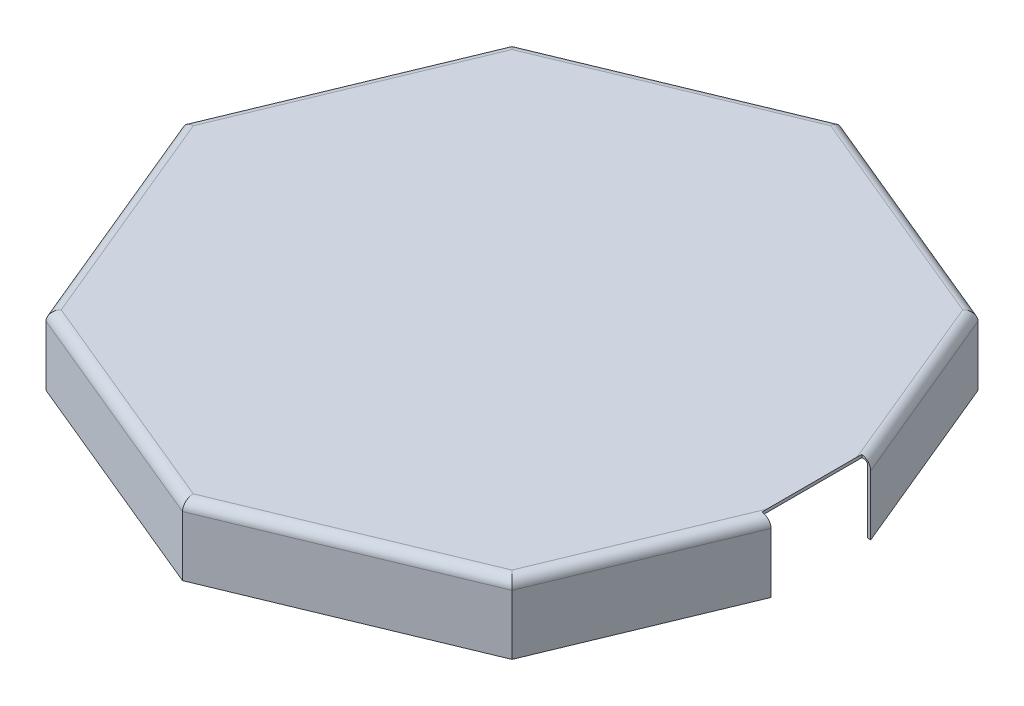
ISO-10303-21;
HEADER;
FILE_DESCRIPTION(('STEP AP214'),'2;1');
FILE_NAME('part.step','',(''),(''),'','','');
FILE_SCHEMA(('AUTOMOTIVE_DESIGN { 1 0 10303 214 1 1 1 1 }'));
ENDSEC;
DATA;
#1=APPLICATION_CONTEXT('core data for automotive mechanical design processes');
#2=APPLICATION_PROTOCOL_DEFINITION('international standard','automotive_design',2000,#1);
#3=PRODUCT_CONTEXT('',#1,'mechanical');
#4=PRODUCT('Part','Part','',(#3));
#5=PRODUCT_RELATED_PRODUCT_CATEGORY('part','',(#4));
#6=PRODUCT_DEFINITION_FORMATION('','',#4);
#7=PRODUCT_DEFINITION_CONTEXT('part definition',#1,'design');
#8=PRODUCT_DEFINITION('design','',#6,#7);
#9=PRODUCT_DEFINITION_SHAPE('','',#8);
#10=(LENGTH_UNIT() NAMED_UNIT(*) SI_UNIT(.MILLI.,.METRE.));
#11=(NAMED_UNIT(*) PLANE_ANGLE_UNIT() SI_UNIT($,.RADIAN.));
#12=(NAMED_UNIT(*) SI_UNIT($,.STERADIAN.) SOLID_ANGLE_UNIT());
#13=UNCERTAINTY_MEASURE_WITH_UNIT(LENGTH_MEASURE(1.E-05),#10,'distance_accuracy_value','');
#14=(GEOMETRIC_REPRESENTATION_CONTEXT(3) GLOBAL_UNCERTAINTY_ASSIGNED_CONTEXT((#13)) GLOBAL_UNIT_ASSIGNED_CONTEXT((#10,
#11,#12)) REPRESENTATION_CONTEXT('',''));
#15=CARTESIAN_POINT('',(0.,0.,0.));
#16=DIRECTION('',(0.,0.,1.));
#17=DIRECTION('',(1.,0.,0.));
#18=AXIS2_PLACEMENT_3D('',#15,#16,#17);
#19=CARTESIAN_POINT('',(0.,70.,330.560430113723));
#20=DIRECTION('',(-0.38268343236509,0.,-0.923879532511287));
#21=DIRECTION('',(-0.923879532511287,0.,0.38268343236509));
#22=AXIS2_PLACEMENT_3D('',#19,#20,#21);
#23=PLANE('',#22);
#24=DIRECTION('',(0.,-1.,0.));
#25=VECTOR('',#24,1.);
#26=CARTESIAN_POINT('',(233.741521725355,70.,233.741521725356));
#27=LINE('',#26,#25);
#28=CARTESIAN_POINT('',(233.741521725355,60.,233.741521725356));
#29=VERTEX_POINT('',#28);
#30=CARTESIAN_POINT('',(233.741521725355,0.,233.741521725356));
#31=VERTEX_POINT('',#30);
#32=EDGE_CURVE('E251',#29,#31,#27,.T.);
#33=ORIENTED_EDGE('',*,*,#32,.F.);
#34=DIRECTION('',(0.923879532511287,0.,-0.38268343236509));
#35=VECTOR('',#34,1.);
#36=CARTESIAN_POINT('',(0.,60.,330.560430113723));
#37=LINE('',#36,#35);
#38=CARTESIAN_POINT('',(0.,60.,330.560430113723));
#39=VERTEX_POINT('',#38);
#40=EDGE_CURVE('E380',#29,#39,#37,.F.);
#41=ORIENTED_EDGE('',*,*,#40,.T.);
#42=DIRECTION('',(0.,-1.,0.));
#43=VECTOR('',#42,1.);
#44=CARTESIAN_POINT('',(0.,70.,330.560430113723));
#45=LINE('',#44,#43);
#46=CARTESIAN_POINT('',(0.,0.,330.560430113723));
#47=VERTEX_POINT('',#46);
#48=EDGE_CURVE('E341',#39,#47,#45,.T.);
#49=ORIENTED_EDGE('',*,*,#48,.T.);
#50=DIRECTION('',(0.923879532511287,0.,-0.38268343236509));
#51=VECTOR('',#50,1.);
#52=CARTESIAN_POINT('',(0.,0.,330.560430113723));
#53=LINE('',#52,#51);
#54=EDGE_CURVE('E282',#47,#31,#53,.T.);
#55=ORIENTED_EDGE('',*,*,#54,.T.);
#56=EDGE_LOOP('',(#33,#41,#49,#55));
#57=FACE_BOUND('',#56,.T.);
#58=ADVANCED_FACE('F37',(#57),#23,.F.);
#59=CARTESIAN_POINT('',(233.741521725355,70.,233.741521725356));
#60=DIRECTION('',(-0.923879532511287,0.,-0.38268343236509));
#61=DIRECTION('',(-0.38268343236509,0.,0.923879532511287));
#62=AXIS2_PLACEMENT_3D('',#59,#60,#61);
#63=PLANE('',#62);
#64=DIRECTION('',(0.,1.,0.));
#65=VECTOR('',#64,1.);
#66=CARTESIAN_POINT('',(309.849751995068,70.,49.9999999999999));
#67=LINE('',#66,#65);
#68=CARTESIAN_POINT('',(309.849751995068,0.,50.));
#69=VERTEX_POINT('',#68);
#70=CARTESIAN_POINT('',(309.849751995068,60.,49.9999999999999));
#71=VERTEX_POINT('',#70);
#72=EDGE_CURVE('E276',#69,#71,#67,.T.);
#73=ORIENTED_EDGE('',*,*,#72,.T.);
#74=DIRECTION('',(0.38268343236509,0.,-0.923879532511287));
#75=VECTOR('',#74,1.);
#76=CARTESIAN_POINT('',(233.741521725355,60.,233.741521725356));
#77=LINE('',#76,#75);
#78=EDGE_CURVE('E378',#71,#29,#77,.F.);
#79=ORIENTED_EDGE('',*,*,#78,.T.);
#80=ORIENTED_EDGE('',*,*,#32,.T.);
#81=DIRECTION('',(0.38268343236509,0.,-0.923879532511287));
#82=VECTOR('',#81,1.);
#83=CARTESIAN_POINT('',(233.741521725355,0.,233.741521725356));
#84=LINE('',#83,#82);
#85=EDGE_CURVE('E320',#31,#69,#84,.T.);
#86=ORIENTED_EDGE('',*,*,#85,.T.);
#87=EDGE_LOOP('',(#73,#79,#80,#86));
#88=FACE_BOUND('',#87,.T.);
#89=ADVANCED_FACE('F487',(#88),#63,.F.);
#90=CARTESIAN_POINT('',(330.560430113723,70.,0.));
#91=DIRECTION('',(-0.923879532511287,0.,0.38268343236509));
#92=DIRECTION('',(0.38268343236509,0.,0.923879532511287));
#93=AXIS2_PLACEMENT_3D('',#90,#91,#92);
#94=PLANE('',#93);
#95=DIRECTION('',(0.,-1.,0.));
#96=VECTOR('',#95,1.);
#97=CARTESIAN_POINT('',(233.741521725355,70.,-233.741521725356));
#98=LINE('',#97,#96);
#99=CARTESIAN_POINT('',(233.741521725355,60.,-233.741521725356));
#100=VERTEX_POINT('',#99);
#101=CARTESIAN_POINT('',(233.741521725355,0.,-233.741521725356));
#102=VERTEX_POINT('',#101);
#103=EDGE_CURVE('E351',#100,#102,#98,.T.);
#104=ORIENTED_EDGE('',*,*,#103,.F.);
#105=DIRECTION('',(-0.38268343236509,0.,-0.923879532511287));
#106=VECTOR('',#105,1.);
#107=CARTESIAN_POINT('',(309.849751995068,60.,-50.));
#108=LINE('',#107,#106);
#109=CARTESIAN_POINT('',(309.849751995068,60.,-50.));
#110=VERTEX_POINT('',#109);
#111=EDGE_CURVE('E392',#100,#110,#108,.F.);
#112=ORIENTED_EDGE('',*,*,#111,.T.);
#113=DIRECTION('',(0.,-1.,0.));
#114=VECTOR('',#113,1.);
#115=CARTESIAN_POINT('',(309.849751995068,70.,-50.));
#116=LINE('',#115,#114);
#117=CARTESIAN_POINT('',(309.849751995068,0.,-50.));
#118=VERTEX_POINT('',#117);
#119=EDGE_CURVE('E271',#110,#118,#116,.T.);
#120=ORIENTED_EDGE('',*,*,#119,.T.);
#121=DIRECTION('',(-0.38268343236509,0.,-0.923879532511287));
#122=VECTOR('',#121,1.);
#123=CARTESIAN_POINT('',(330.560430113723,0.,0.));
#124=LINE('',#123,#122);
#125=EDGE_CURVE('E323',#118,#102,#124,.T.);
#126=ORIENTED_EDGE('',*,*,#125,.T.);
#127=EDGE_LOOP('',(#104,#112,#120,#126));
#128=FACE_BOUND('',#127,.T.);
#129=ADVANCED_FACE('F558',(#128),#94,.F.);
#130=CARTESIAN_POINT('',(233.741521725355,70.,-233.741521725356));
#131=DIRECTION('',(-0.38268343236509,0.,0.923879532511287));
#132=DIRECTION('',(0.923879532511287,0.,0.38268343236509));
#133=AXIS2_PLACEMENT_3D('',#130,#131,#132);
#134=PLANE('',#133);
#135=DIRECTION('',(0.,-1.,0.));
#136=VECTOR('',#135,1.);
#137=CARTESIAN_POINT('',(0.,70.,-330.560430113723));
#138=LINE('',#137,#136);
#139=CARTESIAN_POINT('',(0.,60.,-330.560430113723));
#140=VERTEX_POINT('',#139);
#141=CARTESIAN_POINT('',(0.,0.,-330.560430113723));
#142=VERTEX_POINT('',#141);
#143=EDGE_CURVE('E349',#140,#142,#138,.T.);
#144=ORIENTED_EDGE('',*,*,#143,.F.);
#145=DIRECTION('',(-0.923879532511287,0.,-0.38268343236509));
#146=VECTOR('',#145,1.);
#147=CARTESIAN_POINT('',(233.741521725355,60.,-233.741521725356));
#148=LINE('',#147,#146);
#149=EDGE_CURVE('E390',#140,#100,#148,.F.);
#150=ORIENTED_EDGE('',*,*,#149,.T.);
#151=ORIENTED_EDGE('',*,*,#103,.T.);
#152=DIRECTION('',(-0.923879532511287,0.,-0.38268343236509));
#153=VECTOR('',#152,1.);
#154=CARTESIAN_POINT('',(233.741521725355,0.,-233.741521725356));
#155=LINE('',#154,#153);
#156=EDGE_CURVE('E326',#102,#142,#155,.T.);
#157=ORIENTED_EDGE('',*,*,#156,.T.);
#158=EDGE_LOOP('',(#144,#150,#151,#157));
#159=FACE_BOUND('',#158,.T.);
#160=ADVANCED_FACE('F552',(#159),#134,.F.);
#161=CARTESIAN_POINT('',(0.,70.,-330.560430113723));
#162=DIRECTION('',(0.38268343236509,0.,0.923879532511287));
#163=DIRECTION('',(0.923879532511287,0.,-0.38268343236509));
#164=AXIS2_PLACEMENT_3D('',#161,#162,#163);
#165=PLANE('',#164);
#166=DIRECTION('',(0.,-1.,0.));
#167=VECTOR('',#166,1.);
#168=CARTESIAN_POINT('',(-233.741521725356,70.,-233.741521725356));
#169=LINE('',#168,#167);
#170=CARTESIAN_POINT('',(-233.741521725356,60.,-233.741521725356));
#171=VERTEX_POINT('',#170);
#172=CARTESIAN_POINT('',(-233.741521725356,0.,-233.741521725356));
#173=VERTEX_POINT('',#172);
#174=EDGE_CURVE('E347',#171,#173,#169,.T.);
#175=ORIENTED_EDGE('',*,*,#174,.F.);
#176=DIRECTION('',(-0.923879532511287,0.,0.38268343236509));
#177=VECTOR('',#176,1.);
#178=CARTESIAN_POINT('',(0.,60.,-330.560430113723));
#179=LINE('',#178,#177);
#180=EDGE_CURVE('E388',#171,#140,#179,.F.);
#181=ORIENTED_EDGE('',*,*,#180,.T.);
#182=ORIENTED_EDGE('',*,*,#143,.T.);
#183=DIRECTION('',(-0.923879532511287,0.,0.38268343236509));
#184=VECTOR('',#183,1.);
#185=CARTESIAN_POINT('',(0.,0.,-330.560430113723));
#186=LINE('',#185,#184);
#187=EDGE_CURVE('E329',#142,#173,#186,.T.);
#188=ORIENTED_EDGE('',*,*,#187,.T.);
#189=EDGE_LOOP('',(#175,#181,#182,#188));
#190=FACE_BOUND('',#189,.T.);
#191=ADVANCED_FACE('F549',(#190),#165,.F.);
#192=CARTESIAN_POINT('',(-233.741521725356,70.,-233.741521725356));
#193=DIRECTION('',(0.923879532511287,0.,0.382683432365089));
#194=DIRECTION('',(0.38268343236509,0.,-0.923879532511287));
#195=AXIS2_PLACEMENT_3D('',#192,#193,#194);
#196=PLANE('',#195);
#197=DIRECTION('',(0.,-1.,0.));
#198=VECTOR('',#197,1.);
#199=CARTESIAN_POINT('',(-330.560430113723,70.,0.));
#200=LINE('',#199,#198);
#201=CARTESIAN_POINT('',(-330.560430113723,60.,0.));
#202=VERTEX_POINT('',#201);
#203=CARTESIAN_POINT('',(-330.560430113723,0.,0.));
#204=VERTEX_POINT('',#203);
#205=EDGE_CURVE('E345',#202,#204,#200,.T.);
#206=ORIENTED_EDGE('',*,*,#205,.F.);
#207=DIRECTION('',(-0.38268343236509,0.,0.923879532511287));
#208=VECTOR('',#207,1.);
#209=CARTESIAN_POINT('',(-233.741521725356,60.,-233.741521725356));
#210=LINE('',#209,#208);
#211=EDGE_CURVE('E386',#202,#171,#210,.F.);
#212=ORIENTED_EDGE('',*,*,#211,.T.);
#213=ORIENTED_EDGE('',*,*,#174,.T.);
#214=DIRECTION('',(-0.382683432365089,0.,0.923879532511287));
#215=VECTOR('',#214,1.);
#216=CARTESIAN_POINT('',(-233.741521725356,0.,-233.741521725356));
#217=LINE('',#216,#215);
#218=EDGE_CURVE('E332',#173,#204,#217,.T.);
#219=ORIENTED_EDGE('',*,*,#218,.T.);
#220=EDGE_LOOP('',(#206,#212,#213,#219));
#221=FACE_BOUND('',#220,.T.);
#222=ADVANCED_FACE('F546',(#221),#196,.F.);
#223=CARTESIAN_POINT('',(-330.560430113723,70.,0.));
#224=DIRECTION('',(0.923879532511287,0.,-0.38268343236509));
#225=DIRECTION('',(-0.38268343236509,0.,-0.923879532511287));
#226=AXIS2_PLACEMENT_3D('',#223,#224,#225);
#227=PLANE('',#226);
#228=DIRECTION('',(0.,-1.,0.));
#229=VECTOR('',#228,1.);
#230=CARTESIAN_POINT('',(-233.741521725356,70.,233.741521725356));
#231=LINE('',#230,#229);
#232=CARTESIAN_POINT('',(-233.741521725356,60.,233.741521725356));
#233=VERTEX_POINT('',#232);
#234=CARTESIAN_POINT('',(-233.741521725356,0.,233.741521725356));
#235=VERTEX_POINT('',#234);
#236=EDGE_CURVE('E343',#233,#235,#231,.T.);
#237=ORIENTED_EDGE('',*,*,#236,.F.);
#238=DIRECTION('',(0.38268343236509,0.,0.923879532511287));
#239=VECTOR('',#238,1.);
#240=CARTESIAN_POINT('',(-330.560430113723,60.,0.));
#241=LINE('',#240,#239);
#242=EDGE_CURVE('E384',#233,#202,#241,.F.);
#243=ORIENTED_EDGE('',*,*,#242,.T.);
#244=ORIENTED_EDGE('',*,*,#205,.T.);
#245=DIRECTION('',(0.38268343236509,0.,0.923879532511287));
#246=VECTOR('',#245,1.);
#247=CARTESIAN_POINT('',(-330.560430113723,0.,0.));
#248=LINE('',#247,#246);
#249=EDGE_CURVE('E335',#204,#235,#248,.T.);
#250=ORIENTED_EDGE('',*,*,#249,.T.);
#251=EDGE_LOOP('',(#237,#243,#244,#250));
#252=FACE_BOUND('',#251,.T.);
#253=ADVANCED_FACE('F538',(#252),#227,.F.);
#254=CARTESIAN_POINT('',(-233.741521725356,70.,233.741521725356));
#255=DIRECTION('',(0.38268343236509,0.,-0.923879532511287));
#256=DIRECTION('',(-0.923879532511287,0.,-0.38268343236509));
#257=AXIS2_PLACEMENT_3D('',#254,#255,#256);
#258=PLANE('',#257);
#259=ORIENTED_EDGE('',*,*,#48,.F.);
#260=DIRECTION('',(0.923879532511287,0.,0.38268343236509));
#261=VECTOR('',#260,1.);
#262=CARTESIAN_POINT('',(-233.741521725356,60.,233.741521725355));
#263=LINE('',#262,#261);
#264=EDGE_CURVE('E382',#39,#233,#263,.F.);
#265=ORIENTED_EDGE('',*,*,#264,.T.);
#266=ORIENTED_EDGE('',*,*,#236,.T.);
#267=DIRECTION('',(0.923879532511287,0.,0.38268343236509));
#268=VECTOR('',#267,1.);
#269=CARTESIAN_POINT('',(-233.741521725356,0.,233.741521725356));
#270=LINE('',#269,#268);
#271=EDGE_CURVE('E338',#235,#47,#270,.T.);
#272=ORIENTED_EDGE('',*,*,#271,.T.);
#273=EDGE_LOOP('',(#259,#265,#266,#272));
#274=FACE_BOUND('',#273,.T.);
#275=ADVANCED_FACE('F536',(#274),#258,.F.);
#276=CARTESIAN_POINT('',(0.,70.,0.));
#277=DIRECTION('',(0.,1.,0.));
#278=DIRECTION('',(0.,0.,1.));
#279=AXIS2_PLACEMENT_3D('',#276,#277,#278);
#280=PLANE('',#279);
#281=DIRECTION('',(0.923879532511287,0.,-0.38268343236509));
#282=VECTOR('',#281,1.);
#283=CARTESIAN_POINT('',(229.914687401705,70.,224.502726400243));
#284=LINE('',#283,#282);
#285=CARTESIAN_POINT('',(1.2409284832605E-13,70.,319.736508110799));
#286=VERTEX_POINT('',#285);
#287=CARTESIAN_POINT('',(226.087853078054,70.,226.087853078054));
#288=VERTEX_POINT('',#287);
#289=EDGE_CURVE('E367',#286,#288,#284,.T.);
#290=ORIENTED_EDGE('',*,*,#289,.T.);
#291=DIRECTION('',(0.38268343236509,0.,-0.923879532511287));
#292=VECTOR('',#291,1.);
#293=CARTESIAN_POINT('',(300.610956669956,70.,46.173165676349));
#294=LINE('',#293,#292);
#295=CARTESIAN_POINT('',(301.,70.,45.233931992605));
#296=VERTEX_POINT('',#295);
#297=EDGE_CURVE('E369',#288,#296,#294,.T.);
#298=ORIENTED_EDGE('',*,*,#297,.T.);
#299=DIRECTION('',(0.,0.,1.));
#300=VECTOR('',#299,1.);
#301=CARTESIAN_POINT('',(301.,70.,0.));
#302=LINE('',#301,#300);
#303=CARTESIAN_POINT('',(301.,70.,-45.233931992605));
#304=VERTEX_POINT('',#303);
#305=EDGE_CURVE('E266',#304,#296,#302,.T.);
#306=ORIENTED_EDGE('',*,*,#305,.F.);
#307=DIRECTION('',(-0.38268343236509,0.,-0.923879532511287));
#308=VECTOR('',#307,1.);
#309=CARTESIAN_POINT('',(224.502726400243,70.,-229.914687401705));
#310=LINE('',#309,#308);
#311=CARTESIAN_POINT('',(226.087853078054,70.,-226.087853078054));
#312=VERTEX_POINT('',#311);
#313=EDGE_CURVE('E355',#304,#312,#310,.T.);
#314=ORIENTED_EDGE('',*,*,#313,.T.);
#315=DIRECTION('',(-0.923879532511287,0.,-0.38268343236509));
#316=VECTOR('',#315,1.);
#317=CARTESIAN_POINT('',(-3.8268343236509,70.,-321.32163478861));
#318=LINE('',#317,#316);
#319=CARTESIAN_POINT('',(0.,70.,-319.736508110799));
#320=VERTEX_POINT('',#319);
#321=EDGE_CURVE('E357',#312,#320,#318,.T.);
#322=ORIENTED_EDGE('',*,*,#321,.T.);
#323=DIRECTION('',(-0.923879532511287,0.,0.38268343236509));
#324=VECTOR('',#323,1.);
#325=CARTESIAN_POINT('',(-229.914687401705,70.,-224.502726400243));
#326=LINE('',#325,#324);
#327=CARTESIAN_POINT('',(-226.087853078054,70.,-226.087853078054));
#328=VERTEX_POINT('',#327);
#329=EDGE_CURVE('E359',#320,#328,#326,.T.);
#330=ORIENTED_EDGE('',*,*,#329,.T.);
#331=DIRECTION('',(-0.38268343236509,0.,0.923879532511287));
#332=VECTOR('',#331,1.);
#333=CARTESIAN_POINT('',(-321.32163478861,70.,3.82683432365098));
#334=LINE('',#333,#332);
#335=CARTESIAN_POINT('',(-319.736508110799,70.,1.11481650750052E-13));
#336=VERTEX_POINT('',#335);
#337=EDGE_CURVE('E361',#328,#336,#334,.T.);
#338=ORIENTED_EDGE('',*,*,#337,.T.);
#339=DIRECTION('',(0.38268343236509,0.,0.923879532511287));
#340=VECTOR('',#339,1.);
#341=CARTESIAN_POINT('',(-224.502726400243,70.,229.914687401705));
#342=LINE('',#341,#340);
#343=CARTESIAN_POINT('',(-226.087853078054,70.,226.087853078054));
#344=VERTEX_POINT('',#343);
#345=EDGE_CURVE('E363',#336,#344,#342,.T.);
#346=ORIENTED_EDGE('',*,*,#345,.T.);
#347=DIRECTION('',(0.923879532511287,0.,0.38268343236509));
#348=VECTOR('',#347,1.);
#349=CARTESIAN_POINT('',(3.82683432365095,70.,321.32163478861));
#350=LINE('',#349,#348);
#351=EDGE_CURVE('E365',#344,#286,#350,.T.);
#352=ORIENTED_EDGE('',*,*,#351,.T.);
#353=EDGE_LOOP('',(#290,#298,#306,#314,#322,#330,#338,#346,#352));
#354=FACE_BOUND('',#353,.T.);
#355=ADVANCED_FACE('F504',(#354),#280,.T.);
#356=CARTESIAN_POINT('',(0.,0.,0.));
#357=DIRECTION('',(0.,1.,0.));
#358=DIRECTION('',(0.,0.,1.));
#359=AXIS2_PLACEMENT_3D('',#356,#357,#358);
#360=PLANE('',#359);
#361=DIRECTION('',(0.38268343236509,0.,-0.923879532511287));
#362=VECTOR('',#361,1.);
#363=CARTESIAN_POINT('',(230.969883127822,0.,232.59347142826));
#364=LINE('',#363,#362);
#365=CARTESIAN_POINT('',(231.445421131165,0.,231.445421131165));
#366=VERTEX_POINT('',#365);
#367=CARTESIAN_POINT('',(306.602575394191,0.,49.9999999999999));
#368=VERTEX_POINT('',#367);
#369=EDGE_CURVE('E298',#366,#368,#364,.T.);
#370=ORIENTED_EDGE('',*,*,#369,.T.);
#371=DIRECTION('',(1.,0.,0.));
#372=VECTOR('',#371,1.);
#373=CARTESIAN_POINT('',(301.,0.,50.));
#374=LINE('',#373,#372);
#375=EDGE_CURVE('E257',#368,#69,#374,.T.);
#376=ORIENTED_EDGE('',*,*,#375,.T.);
#377=ORIENTED_EDGE('',*,*,#85,.F.);
#378=ORIENTED_EDGE('',*,*,#54,.F.);
#379=ORIENTED_EDGE('',*,*,#271,.F.);
#380=ORIENTED_EDGE('',*,*,#249,.F.);
#381=ORIENTED_EDGE('',*,*,#218,.F.);
#382=ORIENTED_EDGE('',*,*,#187,.F.);
#383=ORIENTED_EDGE('',*,*,#156,.F.);
#384=ORIENTED_EDGE('',*,*,#125,.F.);
#385=DIRECTION('',(1.,0.,0.));
#386=VECTOR('',#385,1.);
#387=CARTESIAN_POINT('',(301.,0.,-50.));
#388=LINE('',#387,#386);
#389=CARTESIAN_POINT('',(306.602575394191,0.,-50.0000000000001));
#390=VERTEX_POINT('',#389);
#391=EDGE_CURVE('E260',#390,#118,#388,.T.);
#392=ORIENTED_EDGE('',*,*,#391,.F.);
#393=DIRECTION('',(-0.38268343236509,0.,-0.923879532511287));
#394=VECTOR('',#393,1.);
#395=CARTESIAN_POINT('',(327.788791516189,0.,1.14805029709521));
#396=LINE('',#395,#394);
#397=CARTESIAN_POINT('',(231.445421131165,0.,-231.445421131165));
#398=VERTEX_POINT('',#397);
#399=EDGE_CURVE('E313',#390,#398,#396,.T.);
#400=ORIENTED_EDGE('',*,*,#399,.T.);
#401=DIRECTION('',(-0.923879532511287,0.,-0.38268343236509));
#402=VECTOR('',#401,1.);
#403=CARTESIAN_POINT('',(232.59347142826,0.,-230.969883127822));
#404=LINE('',#403,#402);
#405=CARTESIAN_POINT('',(0.,0.,-327.313253512846));
#406=VERTEX_POINT('',#405);
#407=EDGE_CURVE('E310',#398,#406,#404,.T.);
#408=ORIENTED_EDGE('',*,*,#407,.T.);
#409=DIRECTION('',(-0.923879532511287,0.,0.38268343236509));
#410=VECTOR('',#409,1.);
#411=CARTESIAN_POINT('',(1.14805029709527,0.,-327.788791516189));
#412=LINE('',#411,#410);
#413=CARTESIAN_POINT('',(-231.445421131165,0.,-231.445421131165));
#414=VERTEX_POINT('',#413);
#415=EDGE_CURVE('E307',#406,#414,#412,.T.);
#416=ORIENTED_EDGE('',*,*,#415,.T.);
#417=DIRECTION('',(-0.38268343236509,0.,0.923879532511287));
#418=VECTOR('',#417,1.);
#419=CARTESIAN_POINT('',(-230.969883127822,0.,-232.59347142826));
#420=LINE('',#419,#418);
#421=CARTESIAN_POINT('',(-327.313253512846,0.,0.));
#422=VERTEX_POINT('',#421);
#423=EDGE_CURVE('E304',#414,#422,#420,.T.);
#424=ORIENTED_EDGE('',*,*,#423,.T.);
#425=DIRECTION('',(0.38268343236509,0.,0.923879532511287));
#426=VECTOR('',#425,1.);
#427=CARTESIAN_POINT('',(-327.788791516189,0.,-1.14805029709527));
#428=LINE('',#427,#426);
#429=CARTESIAN_POINT('',(-231.445421131165,0.,231.445421131165));
#430=VERTEX_POINT('',#429);
#431=EDGE_CURVE('E301',#422,#430,#428,.T.);
#432=ORIENTED_EDGE('',*,*,#431,.T.);
#433=DIRECTION('',(0.923879532511287,0.,0.38268343236509));
#434=VECTOR('',#433,1.);
#435=CARTESIAN_POINT('',(-232.59347142826,0.,230.969883127822));
#436=LINE('',#435,#434);
#437=CARTESIAN_POINT('',(0.,0.,327.313253512846));
#438=VERTEX_POINT('',#437);
#439=EDGE_CURVE('E287',#430,#438,#436,.T.);
#440=ORIENTED_EDGE('',*,*,#439,.T.);
#441=DIRECTION('',(0.923879532511287,0.,-0.38268343236509));
#442=VECTOR('',#441,1.);
#443=CARTESIAN_POINT('',(-1.14805029709527,0.,327.788791516189));
#444=LINE('',#443,#442);
#445=EDGE_CURVE('E279',#438,#366,#444,.T.);
#446=ORIENTED_EDGE('',*,*,#445,.T.);
#447=EDGE_LOOP('',(#370,#376,#377,#378,#379,#380,#381,#382,#383,#384,#392,#400,#408,#416,#424,
#432,#440,#446));
#448=FACE_BOUND('',#447,.T.);
#449=ADVANCED_FACE('F484',(#448),#360,.F.);
#450=CARTESIAN_POINT('',(-1.14805029709527,70.,327.788791516189));
#451=DIRECTION('',(-0.38268343236509,0.,-0.923879532511287));
#452=DIRECTION('',(-0.923879532511287,0.,0.38268343236509));
#453=AXIS2_PLACEMENT_3D('',#450,#451,#452);
#454=PLANE('',#453);
#455=DIRECTION('',(0.,-1.,0.));
#456=VECTOR('',#455,1.);
#457=CARTESIAN_POINT('',(0.,70.,327.313253512846));
#458=LINE('',#457,#456);
#459=CARTESIAN_POINT('',(0.,64.,327.313253512846));
#460=VERTEX_POINT('',#459);
#461=EDGE_CURVE('E284',#460,#438,#458,.T.);
#462=ORIENTED_EDGE('',*,*,#461,.F.);
#463=DIRECTION('',(0.923879532511287,0.,-0.38268343236509));
#464=VECTOR('',#463,1.);
#465=CARTESIAN_POINT('',(-1.14805029709527,64.,327.788791516189));
#466=LINE('',#465,#464);
#467=CARTESIAN_POINT('',(231.445421131165,64.,231.445421131165));
#468=VERTEX_POINT('',#467);
#469=EDGE_CURVE('E435',#460,#468,#466,.T.);
#470=ORIENTED_EDGE('',*,*,#469,.T.);
#471=DIRECTION('',(0.,-1.,0.));
#472=VECTOR('',#471,1.);
#473=CARTESIAN_POINT('',(231.445421131165,70.,231.445421131165));
#474=LINE('',#473,#472);
#475=EDGE_CURVE('E280',#468,#366,#474,.T.);
#476=ORIENTED_EDGE('',*,*,#475,.T.);
#477=ORIENTED_EDGE('',*,*,#445,.F.);
#478=EDGE_LOOP('',(#462,#470,#476,#477));
#479=FACE_BOUND('',#478,.T.);
#480=ADVANCED_FACE('F599',(#479),#454,.T.);
#481=CARTESIAN_POINT('',(230.969883127822,70.,232.59347142826));
#482=DIRECTION('',(-0.923879532511287,0.,-0.38268343236509));
#483=DIRECTION('',(-0.38268343236509,0.,0.923879532511287));
#484=AXIS2_PLACEMENT_3D('',#481,#482,#483);
#485=PLANE('',#484);
#486=ORIENTED_EDGE('',*,*,#475,.F.);
#487=DIRECTION('',(0.38268343236509,0.,-0.923879532511287));
#488=VECTOR('',#487,1.);
#489=CARTESIAN_POINT('',(230.969883127822,64.,232.59347142826));
#490=LINE('',#489,#488);
#491=CARTESIAN_POINT('',(306.602575394191,64.,50.));
#492=VERTEX_POINT('',#491);
#493=EDGE_CURVE('E433',#468,#492,#490,.T.);
#494=ORIENTED_EDGE('',*,*,#493,.T.);
#495=DIRECTION('',(0.,1.,0.));
#496=VECTOR('',#495,1.);
#497=CARTESIAN_POINT('',(306.602575394191,70.,50.));
#498=LINE('',#497,#496);
#499=EDGE_CURVE('E273',#368,#492,#498,.T.);
#500=ORIENTED_EDGE('',*,*,#499,.F.);
#501=ORIENTED_EDGE('',*,*,#369,.F.);
#502=EDGE_LOOP('',(#486,#494,#500,#501));
#503=FACE_BOUND('',#502,.T.);
#504=ADVANCED_FACE('F478',(#503),#485,.T.);
#505=CARTESIAN_POINT('',(327.788791516189,70.,1.14805029709521));
#506=DIRECTION('',(-0.923879532511287,0.,0.38268343236509));
#507=DIRECTION('',(0.38268343236509,0.,0.923879532511287));
#508=AXIS2_PLACEMENT_3D('',#505,#506,#507);
#509=PLANE('',#508);
#510=DIRECTION('',(0.,-1.,0.));
#511=VECTOR('',#510,1.);
#512=CARTESIAN_POINT('',(306.602575394191,70.,-50.));
#513=LINE('',#512,#511);
#514=CARTESIAN_POINT('',(306.602575394191,64.,-50.));
#515=VERTEX_POINT('',#514);
#516=EDGE_CURVE('E269',#515,#390,#513,.T.);
#517=ORIENTED_EDGE('',*,*,#516,.F.);
#518=DIRECTION('',(-0.38268343236509,0.,-0.923879532511287));
#519=VECTOR('',#518,1.);
#520=CARTESIAN_POINT('',(327.788791516189,64.,1.14805029709521));
#521=LINE('',#520,#519);
#522=CARTESIAN_POINT('',(231.445421131165,64.,-231.445421131165));
#523=VERTEX_POINT('',#522);
#524=EDGE_CURVE('E395',#515,#523,#521,.T.);
#525=ORIENTED_EDGE('',*,*,#524,.T.);
#526=DIRECTION('',(0.,-1.,0.));
#527=VECTOR('',#526,1.);
#528=CARTESIAN_POINT('',(231.445421131165,70.,-231.445421131165));
#529=LINE('',#528,#527);
#530=EDGE_CURVE('E283',#523,#398,#529,.T.);
#531=ORIENTED_EDGE('',*,*,#530,.T.);
#532=ORIENTED_EDGE('',*,*,#399,.F.);
#533=EDGE_LOOP('',(#517,#525,#531,#532));
#534=FACE_BOUND('',#533,.T.);
#535=ADVANCED_FACE('F562',(#534),#509,.T.);
#536=CARTESIAN_POINT('',(232.59347142826,70.,-230.969883127822));
#537=DIRECTION('',(-0.38268343236509,0.,0.923879532511287));
#538=DIRECTION('',(0.923879532511287,0.,0.38268343236509));
#539=AXIS2_PLACEMENT_3D('',#536,#537,#538);
#540=PLANE('',#539);
#541=ORIENTED_EDGE('',*,*,#530,.F.);
#542=DIRECTION('',(-0.923879532511287,0.,-0.38268343236509));
#543=VECTOR('',#542,1.);
#544=CARTESIAN_POINT('',(232.59347142826,64.,-230.969883127822));
#545=LINE('',#544,#543);
#546=CARTESIAN_POINT('',(0.,64.,-327.313253512846));
#547=VERTEX_POINT('',#546);
#548=EDGE_CURVE('E54',#523,#547,#545,.T.);
#549=ORIENTED_EDGE('',*,*,#548,.T.);
#550=DIRECTION('',(0.,-1.,0.));
#551=VECTOR('',#550,1.);
#552=CARTESIAN_POINT('',(0.,70.,-327.313253512846));
#553=LINE('',#552,#551);
#554=EDGE_CURVE('E289',#547,#406,#553,.T.);
#555=ORIENTED_EDGE('',*,*,#554,.T.);
#556=ORIENTED_EDGE('',*,*,#407,.F.);
#557=EDGE_LOOP('',(#541,#549,#555,#556));
#558=FACE_BOUND('',#557,.T.);
#559=ADVANCED_FACE('F603',(#558),#540,.T.);
#560=CARTESIAN_POINT('',(1.14805029709527,70.,-327.788791516189));
#561=DIRECTION('',(0.38268343236509,0.,0.923879532511287));
#562=DIRECTION('',(0.923879532511287,0.,-0.38268343236509));
#563=AXIS2_PLACEMENT_3D('',#560,#561,#562);
#564=PLANE('',#563);
#565=ORIENTED_EDGE('',*,*,#554,.F.);
#566=DIRECTION('',(-0.923879532511287,0.,0.38268343236509));
#567=VECTOR('',#566,1.);
#568=CARTESIAN_POINT('',(1.14805029709527,64.,-327.788791516189));
#569=LINE('',#568,#567);
#570=CARTESIAN_POINT('',(-231.445421131165,64.,-231.445421131165));
#571=VERTEX_POINT('',#570);
#572=EDGE_CURVE('E61',#547,#571,#569,.T.);
#573=ORIENTED_EDGE('',*,*,#572,.T.);
#574=DIRECTION('',(0.,-1.,0.));
#575=VECTOR('',#574,1.);
#576=CARTESIAN_POINT('',(-231.445421131165,70.,-231.445421131165));
#577=LINE('',#576,#575);
#578=EDGE_CURVE('E291',#571,#414,#577,.T.);
#579=ORIENTED_EDGE('',*,*,#578,.T.);
#580=ORIENTED_EDGE('',*,*,#415,.F.);
#581=EDGE_LOOP('',(#565,#573,#579,#580));
#582=FACE_BOUND('',#581,.T.);
#583=ADVANCED_FACE('F602',(#582),#564,.T.);
#584=CARTESIAN_POINT('',(-230.969883127822,70.,-232.59347142826));
#585=DIRECTION('',(0.923879532511287,0.,0.382683432365089));
#586=DIRECTION('',(0.38268343236509,0.,-0.923879532511287));
#587=AXIS2_PLACEMENT_3D('',#584,#585,#586);
#588=PLANE('',#587);
#589=ORIENTED_EDGE('',*,*,#578,.F.);
#590=DIRECTION('',(-0.38268343236509,0.,0.923879532511287));
#591=VECTOR('',#590,1.);
#592=CARTESIAN_POINT('',(-230.969883127822,64.,-232.59347142826));
#593=LINE('',#592,#591);
#594=CARTESIAN_POINT('',(-327.313253512846,64.,0.));
#595=VERTEX_POINT('',#594);
#596=EDGE_CURVE('E441',#571,#595,#593,.T.);
#597=ORIENTED_EDGE('',*,*,#596,.T.);
#598=DIRECTION('',(0.,-1.,0.));
#599=VECTOR('',#598,1.);
#600=CARTESIAN_POINT('',(-327.313253512846,70.,0.));
#601=LINE('',#600,#599);
#602=EDGE_CURVE('E293',#595,#422,#601,.T.);
#603=ORIENTED_EDGE('',*,*,#602,.T.);
#604=ORIENTED_EDGE('',*,*,#423,.F.);
#605=EDGE_LOOP('',(#589,#597,#603,#604));
#606=FACE_BOUND('',#605,.T.);
#607=ADVANCED_FACE('F581',(#606),#588,.T.);
#608=CARTESIAN_POINT('',(-327.788791516189,70.,-1.14805029709527));
#609=DIRECTION('',(0.923879532511287,0.,-0.38268343236509));
#610=DIRECTION('',(-0.38268343236509,0.,-0.923879532511287));
#611=AXIS2_PLACEMENT_3D('',#608,#609,#610);
#612=PLANE('',#611);
#613=ORIENTED_EDGE('',*,*,#602,.F.);
#614=DIRECTION('',(0.38268343236509,0.,0.923879532511287));
#615=VECTOR('',#614,1.);
#616=CARTESIAN_POINT('',(-327.788791516189,64.,-1.14805029709527));
#617=LINE('',#616,#615);
#618=CARTESIAN_POINT('',(-231.445421131165,64.,231.445421131165));
#619=VERTEX_POINT('',#618);
#620=EDGE_CURVE('E439',#595,#619,#617,.T.);
#621=ORIENTED_EDGE('',*,*,#620,.T.);
#622=DIRECTION('',(0.,-1.,0.));
#623=VECTOR('',#622,1.);
#624=CARTESIAN_POINT('',(-231.445421131165,70.,231.445421131165));
#625=LINE('',#624,#623);
#626=EDGE_CURVE('E286',#619,#430,#625,.T.);
#627=ORIENTED_EDGE('',*,*,#626,.T.);
#628=ORIENTED_EDGE('',*,*,#431,.F.);
#629=EDGE_LOOP('',(#613,#621,#627,#628));
#630=FACE_BOUND('',#629,.T.);
#631=ADVANCED_FACE('F586',(#630),#612,.T.);
#632=CARTESIAN_POINT('',(-232.59347142826,70.,230.969883127822));
#633=DIRECTION('',(0.38268343236509,0.,-0.923879532511287));
#634=DIRECTION('',(-0.923879532511287,0.,-0.38268343236509));
#635=AXIS2_PLACEMENT_3D('',#632,#633,#634);
#636=PLANE('',#635);
#637=ORIENTED_EDGE('',*,*,#626,.F.);
#638=DIRECTION('',(0.923879532511287,0.,0.38268343236509));
#639=VECTOR('',#638,1.);
#640=CARTESIAN_POINT('',(-232.59347142826,64.,230.969883127822));
#641=LINE('',#640,#639);
#642=EDGE_CURVE('E437',#619,#460,#641,.T.);
#643=ORIENTED_EDGE('',*,*,#642,.T.);
#644=ORIENTED_EDGE('',*,*,#461,.T.);
#645=ORIENTED_EDGE('',*,*,#439,.F.);
#646=EDGE_LOOP('',(#637,#643,#644,#645));
#647=FACE_BOUND('',#646,.T.);
#648=ADVANCED_FACE('F595',(#647),#636,.T.);
#649=CARTESIAN_POINT('',(0.,67.,0.));
#650=DIRECTION('',(0.,1.,0.));
#651=DIRECTION('',(0.,0.,1.));
#652=AXIS2_PLACEMENT_3D('',#649,#650,#651);
#653=PLANE('',#652);
#654=DIRECTION('',(-0.923879532511287,0.,-0.38268343236509));
#655=VECTOR('',#654,1.);
#656=CARTESIAN_POINT('',(114.574660268487,67.,-276.607698724472));
#657=LINE('',#656,#655);
#658=CARTESIAN_POINT('',(0.,67.,-324.066076911969));
#659=VERTEX_POINT('',#658);
#660=CARTESIAN_POINT('',(229.149320536974,67.,-229.149320536974));
#661=VERTEX_POINT('',#660);
#662=EDGE_CURVE('E418',#659,#661,#657,.F.);
#663=ORIENTED_EDGE('',*,*,#662,.T.);
#664=DIRECTION('',(-0.38268343236509,0.,-0.923879532511287));
#665=VECTOR('',#664,1.);
#666=CARTESIAN_POINT('',(276.607698724472,67.,-114.574660268487));
#667=LINE('',#666,#665);
#668=CARTESIAN_POINT('',(303.355398793314,67.,-50.));
#669=VERTEX_POINT('',#668);
#670=EDGE_CURVE('E236',#661,#669,#667,.F.);
#671=ORIENTED_EDGE('',*,*,#670,.T.);
#672=DIRECTION('',(-1.,0.,0.));
#673=VECTOR('',#672,1.);
#674=CARTESIAN_POINT('',(0.,67.,-50.));
#675=LINE('',#674,#673);
#676=CARTESIAN_POINT('',(301.,67.,-50.));
#677=VERTEX_POINT('',#676);
#678=EDGE_CURVE('E230',#669,#677,#675,.T.);
#679=ORIENTED_EDGE('',*,*,#678,.T.);
#680=DIRECTION('',(0.,0.,1.));
#681=VECTOR('',#680,1.);
#682=CARTESIAN_POINT('',(301.,67.,0.));
#683=LINE('',#682,#681);
#684=CARTESIAN_POINT('',(301.,67.,50.));
#685=VERTEX_POINT('',#684);
#686=EDGE_CURVE('E234',#677,#685,#683,.T.);
#687=ORIENTED_EDGE('',*,*,#686,.T.);
#688=DIRECTION('',(1.,0.,0.));
#689=VECTOR('',#688,1.);
#690=CARTESIAN_POINT('',(0.,67.,50.));
#691=LINE('',#690,#689);
#692=CARTESIAN_POINT('',(303.355398793314,67.,50.));
#693=VERTEX_POINT('',#692);
#694=EDGE_CURVE('E240',#685,#693,#691,.T.);
#695=ORIENTED_EDGE('',*,*,#694,.T.);
#696=DIRECTION('',(0.38268343236509,0.,-0.923879532511287));
#697=VECTOR('',#696,1.);
#698=CARTESIAN_POINT('',(276.607698724472,67.,114.574660268487));
#699=LINE('',#698,#697);
#700=CARTESIAN_POINT('',(229.149320536974,67.,229.149320536974));
#701=VERTEX_POINT('',#700);
#702=EDGE_CURVE('E430',#693,#701,#699,.F.);
#703=ORIENTED_EDGE('',*,*,#702,.T.);
#704=DIRECTION('',(0.923879532511287,0.,-0.38268343236509));
#705=VECTOR('',#704,1.);
#706=CARTESIAN_POINT('',(114.574660268487,67.,276.607698724472));
#707=LINE('',#706,#705);
#708=CARTESIAN_POINT('',(0.,67.,324.066076911969));
#709=VERTEX_POINT('',#708);
#710=EDGE_CURVE('E428',#701,#709,#707,.F.);
#711=ORIENTED_EDGE('',*,*,#710,.T.);
#712=DIRECTION('',(0.923879532511287,0.,0.38268343236509));
#713=VECTOR('',#712,1.);
#714=CARTESIAN_POINT('',(-114.574660268487,67.,276.607698724472));
#715=LINE('',#714,#713);
#716=CARTESIAN_POINT('',(-229.149320536974,67.,229.149320536974));
#717=VERTEX_POINT('',#716);
#718=EDGE_CURVE('E426',#709,#717,#715,.F.);
#719=ORIENTED_EDGE('',*,*,#718,.T.);
#720=DIRECTION('',(0.38268343236509,0.,0.923879532511287));
#721=VECTOR('',#720,1.);
#722=CARTESIAN_POINT('',(-276.607698724472,67.,114.574660268487));
#723=LINE('',#722,#721);
#724=CARTESIAN_POINT('',(-324.066076911969,67.,0.));
#725=VERTEX_POINT('',#724);
#726=EDGE_CURVE('E424',#717,#725,#723,.F.);
#727=ORIENTED_EDGE('',*,*,#726,.T.);
#728=DIRECTION('',(-0.38268343236509,0.,0.923879532511287));
#729=VECTOR('',#728,1.);
#730=CARTESIAN_POINT('',(-276.607698724472,67.,-114.574660268487));
#731=LINE('',#730,#729);
#732=CARTESIAN_POINT('',(-229.149320536974,67.,-229.149320536974));
#733=VERTEX_POINT('',#732);
#734=EDGE_CURVE('E422',#725,#733,#731,.F.);
#735=ORIENTED_EDGE('',*,*,#734,.T.);
#736=DIRECTION('',(-0.923879532511287,0.,0.38268343236509));
#737=VECTOR('',#736,1.);
#738=CARTESIAN_POINT('',(-114.574660268487,67.,-276.607698724472));
#739=LINE('',#738,#737);
#740=EDGE_CURVE('E420',#733,#659,#739,.F.);
#741=ORIENTED_EDGE('',*,*,#740,.T.);
#742=EDGE_LOOP('',(#663,#671,#679,#687,#695,#703,#711,#719,#727,#735,#741));
#743=FACE_BOUND('',#742,.T.);
#744=ADVANCED_FACE('F232',(#743),#653,.F.);
#745=CARTESIAN_POINT('',(301.,0.,50.));
#746=DIRECTION('',(0.,0.,1.));
#747=DIRECTION('',(1.,0.,0.));
#748=AXIS2_PLACEMENT_3D('',#745,#746,#747);
#749=PLANE('',#748);
#750=DIRECTION('',(0.,-1.,0.));
#751=VECTOR('',#750,1.);
#752=CARTESIAN_POINT('',(301.,0.,50.));
#753=LINE('',#752,#751);
#754=CARTESIAN_POINT('',(301.,69.8322635270888,50.));
#755=VERTEX_POINT('',#754);
#756=EDGE_CURVE('E249',#755,#685,#753,.T.);
#757=ORIENTED_EDGE('',*,*,#756,.F.);
#758=CARTESIAN_POINT('',(299.025829992145,60.,50.));
#759=DIRECTION('',(0.,0.,1.));
#760=DIRECTION('',(-1.,0.,0.));
#761=AXIS2_PLACEMENT_3D('',#758,#759,#760);
#762=ELLIPSE('',#761,10.8239220029239,10.);
#763=EDGE_CURVE('E376',#755,#71,#762,.F.);
#764=ORIENTED_EDGE('',*,*,#763,.T.);
#765=ORIENTED_EDGE('',*,*,#72,.F.);
#766=ORIENTED_EDGE('',*,*,#375,.F.);
#767=ORIENTED_EDGE('',*,*,#499,.T.);
#768=CARTESIAN_POINT('',(303.355398793314,64.,49.9999999999999));
#769=DIRECTION('',(0.,0.,1.));
#770=DIRECTION('',(1.,0.,0.));
#771=AXIS2_PLACEMENT_3D('',#768,#769,#770);
#772=ELLIPSE('',#771,3.24717660087718,3.);
#773=EDGE_CURVE('E11',#492,#693,#772,.T.);
#774=ORIENTED_EDGE('',*,*,#773,.T.);
#775=ORIENTED_EDGE('',*,*,#694,.F.);
#776=EDGE_LOOP('',(#757,#764,#765,#766,#767,#774,#775));
#777=FACE_BOUND('',#776,.T.);
#778=ADVANCED_FACE('F481',(#777),#749,.F.);
#779=CARTESIAN_POINT('',(301.,0.,-50.));
#780=DIRECTION('',(0.,0.,-1.));
#781=DIRECTION('',(0.,1.,0.));
#782=AXIS2_PLACEMENT_3D('',#779,#780,#781);
#783=PLANE('',#782);
#784=ORIENTED_EDGE('',*,*,#119,.F.);
#785=CARTESIAN_POINT('',(299.025829992145,60.,-50.));
#786=DIRECTION('',(0.,0.,-1.));
#787=DIRECTION('',(1.,0.,0.));
#788=AXIS2_PLACEMENT_3D('',#785,#786,#787);
#789=ELLIPSE('',#788,10.8239220029239,10.);
#790=CARTESIAN_POINT('',(301.,69.8322635270888,-50.));
#791=VERTEX_POINT('',#790);
#792=EDGE_CURVE('E256',#110,#791,#789,.F.);
#793=ORIENTED_EDGE('',*,*,#792,.T.);
#794=DIRECTION('',(0.,1.,0.));
#795=VECTOR('',#794,1.);
#796=CARTESIAN_POINT('',(301.,0.,-50.));
#797=LINE('',#796,#795);
#798=EDGE_CURVE('E246',#677,#791,#797,.T.);
#799=ORIENTED_EDGE('',*,*,#798,.F.);
#800=ORIENTED_EDGE('',*,*,#678,.F.);
#801=CARTESIAN_POINT('',(303.355398793314,64.,-50.));
#802=DIRECTION('',(0.,0.,-1.));
#803=DIRECTION('',(-1.,0.,0.));
#804=AXIS2_PLACEMENT_3D('',#801,#802,#803);
#805=ELLIPSE('',#804,3.24717660087718,3.);
#806=EDGE_CURVE('E46',#669,#515,#805,.T.);
#807=ORIENTED_EDGE('',*,*,#806,.T.);
#808=ORIENTED_EDGE('',*,*,#516,.T.);
#809=ORIENTED_EDGE('',*,*,#391,.T.);
#810=EDGE_LOOP('',(#784,#793,#799,#800,#807,#808,#809));
#811=FACE_BOUND('',#810,.T.);
#812=ADVANCED_FACE('F254',(#811),#783,.F.);
#813=CARTESIAN_POINT('',(301.,0.,0.));
#814=DIRECTION('',(-1.,0.,0.));
#815=DIRECTION('',(0.,0.,1.));
#816=AXIS2_PLACEMENT_3D('',#813,#814,#815);
#817=PLANE('',#816);
#818=ORIENTED_EDGE('',*,*,#305,.T.);
#819=CARTESIAN_POINT('',(301.,60.,45.233931992605));
#820=DIRECTION('',(-1.,0.,0.));
#821=DIRECTION('',(0.,0.,1.));
#822=AXIS2_PLACEMENT_3D('',#819,#820,#821);
#823=ELLIPSE('',#822,26.1312592975275,10.);
#824=EDGE_CURVE('E374',#296,#755,#823,.F.);
#825=ORIENTED_EDGE('',*,*,#824,.T.);
#826=ORIENTED_EDGE('',*,*,#756,.T.);
#827=ORIENTED_EDGE('',*,*,#686,.F.);
#828=ORIENTED_EDGE('',*,*,#798,.T.);
#829=CARTESIAN_POINT('',(301.,60.,-45.2339319926051));
#830=DIRECTION('',(-1.,0.,0.));
#831=DIRECTION('',(0.,0.,1.));
#832=AXIS2_PLACEMENT_3D('',#829,#830,#831);
#833=ELLIPSE('',#832,26.1312592975275,10.);
#834=EDGE_CURVE('E372',#791,#304,#833,.F.);
#835=ORIENTED_EDGE('',*,*,#834,.T.);
#836=EDGE_LOOP('',(#818,#825,#826,#827,#828,#835));
#837=FACE_BOUND('',#836,.T.);
#838=ADVANCED_FACE('F245',(#837),#817,.F.);
#839=CARTESIAN_POINT('',(272.912180594426,60.,-113.043926539027));
#840=DIRECTION('',(0.38268343236509,0.,0.923879532511287));
#841=DIRECTION('',(0.923879532511287,0.,-0.38268343236509));
#842=AXIS2_PLACEMENT_3D('',#839,#840,#841);
#843=CYLINDRICAL_SURFACE('',#842,10.);
#844=ORIENTED_EDGE('',*,*,#792,.F.);
#845=ORIENTED_EDGE('',*,*,#111,.F.);
#846=CARTESIAN_POINT('',(226.087853078054,60.,-226.087853078054));
#847=DIRECTION('',(0.707106781186548,0.,0.707106781186547));
#848=DIRECTION('',(-0.707106781186547,0.,0.707106781186547));
#849=AXIS2_PLACEMENT_3D('',#846,#847,#848);
#850=ELLIPSE('',#849,10.8239220029239,10.);
#851=EDGE_CURVE('E262',#312,#100,#850,.F.);
#852=ORIENTED_EDGE('',*,*,#851,.F.);
#853=ORIENTED_EDGE('',*,*,#313,.F.);
#854=ORIENTED_EDGE('',*,*,#834,.F.);
#855=EDGE_LOOP('',(#844,#845,#852,#853,#854));
#856=FACE_BOUND('',#855,.T.);
#857=ADVANCED_FACE('F507',(#856),#843,.T.);
#858=CARTESIAN_POINT('',(113.043926539027,60.,-272.912180594427));
#859=DIRECTION('',(0.923879532511287,0.,0.38268343236509));
#860=DIRECTION('',(0.38268343236509,0.,-0.923879532511287));
#861=AXIS2_PLACEMENT_3D('',#858,#859,#860);
#862=CYLINDRICAL_SURFACE('',#861,10.);
#863=ORIENTED_EDGE('',*,*,#851,.T.);
#864=ORIENTED_EDGE('',*,*,#149,.F.);
#865=CARTESIAN_POINT('',(0.,60.,-319.736508110799));
#866=DIRECTION('',(1.,0.,0.));
#867=DIRECTION('',(0.,0.,1.));
#868=AXIS2_PLACEMENT_3D('',#865,#866,#867);
#869=ELLIPSE('',#868,10.8239220029239,10.);
#870=EDGE_CURVE('E411',#320,#140,#869,.F.);
#871=ORIENTED_EDGE('',*,*,#870,.F.);
#872=ORIENTED_EDGE('',*,*,#321,.F.);
#873=EDGE_LOOP('',(#863,#864,#871,#872));
#874=FACE_BOUND('',#873,.T.);
#875=ADVANCED_FACE('F516',(#874),#862,.T.);
#876=CARTESIAN_POINT('',(-113.043926539027,60.,-272.912180594427));
#877=DIRECTION('',(0.923879532511287,0.,-0.38268343236509));
#878=DIRECTION('',(-0.38268343236509,0.,-0.923879532511287));
#879=AXIS2_PLACEMENT_3D('',#876,#877,#878);
#880=CYLINDRICAL_SURFACE('',#879,10.);
#881=ORIENTED_EDGE('',*,*,#870,.T.);
#882=ORIENTED_EDGE('',*,*,#180,.F.);
#883=CARTESIAN_POINT('',(-226.087853078054,60.,-226.087853078054));
#884=DIRECTION('',(0.707106781186547,0.,-0.707106781186548));
#885=DIRECTION('',(0.707106781186548,0.,0.707106781186547));
#886=AXIS2_PLACEMENT_3D('',#883,#884,#885);
#887=ELLIPSE('',#886,10.8239220029239,10.);
#888=EDGE_CURVE('E408',#328,#171,#887,.F.);
#889=ORIENTED_EDGE('',*,*,#888,.F.);
#890=ORIENTED_EDGE('',*,*,#329,.F.);
#891=EDGE_LOOP('',(#881,#882,#889,#890));
#892=FACE_BOUND('',#891,.T.);
#893=ADVANCED_FACE('F519',(#892),#880,.T.);
#894=CARTESIAN_POINT('',(-272.912180594426,60.,-113.043926539027));
#895=DIRECTION('',(0.38268343236509,0.,-0.923879532511287));
#896=DIRECTION('',(-0.923879532511287,0.,-0.382683432365089));
#897=AXIS2_PLACEMENT_3D('',#894,#895,#896);
#898=CYLINDRICAL_SURFACE('',#897,10.);
#899=ORIENTED_EDGE('',*,*,#888,.T.);
#900=ORIENTED_EDGE('',*,*,#211,.F.);
#901=CARTESIAN_POINT('',(-319.736508110799,60.,0.));
#902=DIRECTION('',(0.,0.,-1.));
#903=DIRECTION('',(1.,0.,0.));
#904=AXIS2_PLACEMENT_3D('',#901,#902,#903);
#905=ELLIPSE('',#904,10.8239220029239,10.);
#906=EDGE_CURVE('E405',#336,#202,#905,.F.);
#907=ORIENTED_EDGE('',*,*,#906,.F.);
#908=ORIENTED_EDGE('',*,*,#337,.F.);
#909=EDGE_LOOP('',(#899,#900,#907,#908));
#910=FACE_BOUND('',#909,.T.);
#911=ADVANCED_FACE('F524',(#910),#898,.T.);
#912=CARTESIAN_POINT('',(-272.912180594427,60.,113.043926539027));
#913=DIRECTION('',(-0.38268343236509,0.,-0.923879532511287));
#914=DIRECTION('',(-0.923879532511287,0.,0.38268343236509));
#915=AXIS2_PLACEMENT_3D('',#912,#913,#914);
#916=CYLINDRICAL_SURFACE('',#915,10.);
#917=ORIENTED_EDGE('',*,*,#906,.T.);
#918=ORIENTED_EDGE('',*,*,#242,.F.);
#919=CARTESIAN_POINT('',(-226.087853078054,60.,226.087853078054));
#920=DIRECTION('',(-0.707106781186547,0.,-0.707106781186548));
#921=DIRECTION('',(0.707106781186548,0.,-0.707106781186547));
#922=AXIS2_PLACEMENT_3D('',#919,#920,#921);
#923=ELLIPSE('',#922,10.8239220029239,10.);
#924=EDGE_CURVE('E402',#344,#233,#923,.F.);
#925=ORIENTED_EDGE('',*,*,#924,.F.);
#926=ORIENTED_EDGE('',*,*,#345,.F.);
#927=EDGE_LOOP('',(#917,#918,#925,#926));
#928=FACE_BOUND('',#927,.T.);
#929=ADVANCED_FACE('F530',(#928),#916,.T.);
#930=CARTESIAN_POINT('',(-113.043926539027,60.,272.912180594426));
#931=DIRECTION('',(-0.923879532511287,0.,-0.38268343236509));
#932=DIRECTION('',(-0.38268343236509,0.,0.923879532511287));
#933=AXIS2_PLACEMENT_3D('',#930,#931,#932);
#934=CYLINDRICAL_SURFACE('',#933,10.);
#935=ORIENTED_EDGE('',*,*,#924,.T.);
#936=ORIENTED_EDGE('',*,*,#264,.F.);
#937=CARTESIAN_POINT('',(1.11022302462516E-13,60.,319.736508110799));
#938=DIRECTION('',(-1.,0.,0.));
#939=DIRECTION('',(0.,0.,-1.));
#940=AXIS2_PLACEMENT_3D('',#937,#938,#939);
#941=ELLIPSE('',#940,10.8239220029239,10.);
#942=EDGE_CURVE('E399',#286,#39,#941,.F.);
#943=ORIENTED_EDGE('',*,*,#942,.F.);
#944=ORIENTED_EDGE('',*,*,#351,.F.);
#945=EDGE_LOOP('',(#935,#936,#943,#944));
#946=FACE_BOUND('',#945,.T.);
#947=ADVANCED_FACE('F533',(#946),#934,.T.);
#948=CARTESIAN_POINT('',(113.043926539027,60.,272.912180594427));
#949=DIRECTION('',(-0.923879532511287,0.,0.38268343236509));
#950=DIRECTION('',(0.38268343236509,0.,0.923879532511287));
#951=AXIS2_PLACEMENT_3D('',#948,#949,#950);
#952=CYLINDRICAL_SURFACE('',#951,10.);
#953=ORIENTED_EDGE('',*,*,#942,.T.);
#954=ORIENTED_EDGE('',*,*,#40,.F.);
#955=CARTESIAN_POINT('',(226.087853078054,60.,226.087853078054));
#956=DIRECTION('',(-0.707106781186548,0.,0.707106781186548));
#957=DIRECTION('',(-0.707106781186547,0.,-0.707106781186548));
#958=AXIS2_PLACEMENT_3D('',#955,#956,#957);
#959=ELLIPSE('',#958,10.8239220029239,10.);
#960=EDGE_CURVE('E396',#288,#29,#959,.F.);
#961=ORIENTED_EDGE('',*,*,#960,.F.);
#962=ORIENTED_EDGE('',*,*,#289,.F.);
#963=EDGE_LOOP('',(#953,#954,#961,#962));
#964=FACE_BOUND('',#963,.T.);
#965=ADVANCED_FACE('F495',(#964),#952,.T.);
#966=CARTESIAN_POINT('',(272.912180594426,60.,113.043926539027));
#967=DIRECTION('',(-0.38268343236509,0.,0.923879532511287));
#968=DIRECTION('',(0.923879532511287,0.,0.38268343236509));
#969=AXIS2_PLACEMENT_3D('',#966,#967,#968);
#970=CYLINDRICAL_SURFACE('',#969,10.);
#971=ORIENTED_EDGE('',*,*,#960,.T.);
#972=ORIENTED_EDGE('',*,*,#78,.F.);
#973=ORIENTED_EDGE('',*,*,#763,.F.);
#974=ORIENTED_EDGE('',*,*,#824,.F.);
#975=ORIENTED_EDGE('',*,*,#297,.F.);
#976=EDGE_LOOP('',(#971,#972,#973,#974,#975));
#977=FACE_BOUND('',#976,.T.);
#978=ADVANCED_FACE('F500',(#977),#970,.T.);
#979=CARTESIAN_POINT('',(228.198244530288,64.,231.445421131165));
#980=DIRECTION('',(0.38268343236509,0.,-0.923879532511287));
#981=DIRECTION('',(-0.923879532511287,0.,-0.38268343236509));
#982=AXIS2_PLACEMENT_3D('',#979,#980,#981);
#983=CYLINDRICAL_SURFACE('',#982,3.);
#984=ORIENTED_EDGE('',*,*,#773,.F.);
#985=ORIENTED_EDGE('',*,*,#493,.F.);
#986=CARTESIAN_POINT('',(229.149320536974,64.,229.149320536974));
#987=DIRECTION('',(0.707106781186548,0.,-0.707106781186548));
#988=DIRECTION('',(-0.707106781186547,0.,-0.707106781186548));
#989=AXIS2_PLACEMENT_3D('',#986,#987,#988);
#990=ELLIPSE('',#989,3.24717660087718,3.);
#991=EDGE_CURVE('E41',#701,#468,#990,.T.);
#992=ORIENTED_EDGE('',*,*,#991,.F.);
#993=ORIENTED_EDGE('',*,*,#702,.F.);
#994=EDGE_LOOP('',(#984,#985,#992,#993));
#995=FACE_BOUND('',#994,.T.);
#996=ADVANCED_FACE('F39',(#995),#983,.F.);
#997=CARTESIAN_POINT('',(-2.29610059419054,64.,325.017152918656));
#998=DIRECTION('',(0.923879532511287,0.,-0.38268343236509));
#999=DIRECTION('',(-0.38268343236509,0.,-0.923879532511287));
#1000=AXIS2_PLACEMENT_3D('',#997,#998,#999);
#1001=CYLINDRICAL_SURFACE('',#1000,3.);
#1002=ORIENTED_EDGE('',*,*,#991,.T.);
#1003=ORIENTED_EDGE('',*,*,#469,.F.);
#1004=CARTESIAN_POINT('',(1.41596803726607E-13,64.,324.066076911969));
#1005=DIRECTION('',(1.,0.,0.));
#1006=DIRECTION('',(0.,0.,-1.));
#1007=AXIS2_PLACEMENT_3D('',#1004,#1005,#1006);
#1008=ELLIPSE('',#1007,3.24717660087718,3.);
#1009=EDGE_CURVE('E459',#709,#460,#1008,.T.);
#1010=ORIENTED_EDGE('',*,*,#1009,.F.);
#1011=ORIENTED_EDGE('',*,*,#710,.F.);
#1012=EDGE_LOOP('',(#1002,#1003,#1010,#1011));
#1013=FACE_BOUND('',#1012,.T.);
#1014=ADVANCED_FACE('F470',(#1013),#1001,.F.);
#1015=CARTESIAN_POINT('',(-231.445421131165,64.,228.198244530288));
#1016=DIRECTION('',(0.923879532511287,0.,0.38268343236509));
#1017=DIRECTION('',(0.38268343236509,0.,-0.923879532511287));
#1018=AXIS2_PLACEMENT_3D('',#1015,#1016,#1017);
#1019=CYLINDRICAL_SURFACE('',#1018,3.);
#1020=ORIENTED_EDGE('',*,*,#1009,.T.);
#1021=ORIENTED_EDGE('',*,*,#642,.F.);
#1022=CARTESIAN_POINT('',(-229.149320536974,64.,229.149320536974));
#1023=DIRECTION('',(0.707106781186547,0.,0.707106781186548));
#1024=DIRECTION('',(0.707106781186548,0.,-0.707106781186547));
#1025=AXIS2_PLACEMENT_3D('',#1022,#1023,#1024);
#1026=ELLIPSE('',#1025,3.24717660087718,3.);
#1027=EDGE_CURVE('E457',#717,#619,#1026,.T.);
#1028=ORIENTED_EDGE('',*,*,#1027,.F.);
#1029=ORIENTED_EDGE('',*,*,#718,.F.);
#1030=EDGE_LOOP('',(#1020,#1021,#1028,#1029));
#1031=FACE_BOUND('',#1030,.T.);
#1032=ADVANCED_FACE('F592',(#1031),#1019,.F.);
#1033=CARTESIAN_POINT('',(-325.017152918655,64.,-2.29610059419054));
#1034=DIRECTION('',(0.38268343236509,0.,0.923879532511287));
#1035=DIRECTION('',(0.923879532511287,0.,-0.38268343236509));
#1036=AXIS2_PLACEMENT_3D('',#1033,#1034,#1035);
#1037=CYLINDRICAL_SURFACE('',#1036,3.);
#1038=ORIENTED_EDGE('',*,*,#1027,.T.);
#1039=ORIENTED_EDGE('',*,*,#620,.F.);
#1040=CARTESIAN_POINT('',(-324.066076911969,64.,0.));
#1041=DIRECTION('',(0.,0.,1.));
#1042=DIRECTION('',(1.,0.,0.));
#1043=AXIS2_PLACEMENT_3D('',#1040,#1041,#1042);
#1044=ELLIPSE('',#1043,3.24717660087718,3.);
#1045=EDGE_CURVE('E454',#725,#595,#1044,.T.);
#1046=ORIENTED_EDGE('',*,*,#1045,.F.);
#1047=ORIENTED_EDGE('',*,*,#726,.F.);
#1048=EDGE_LOOP('',(#1038,#1039,#1046,#1047));
#1049=FACE_BOUND('',#1048,.T.);
#1050=ADVANCED_FACE('F589',(#1049),#1037,.F.);
#1051=CARTESIAN_POINT('',(-228.198244530288,64.,-231.445421131165));
#1052=DIRECTION('',(-0.38268343236509,0.,0.923879532511287));
#1053=DIRECTION('',(0.923879532511287,0.,0.382683432365089));
#1054=AXIS2_PLACEMENT_3D('',#1051,#1052,#1053);
#1055=CYLINDRICAL_SURFACE('',#1054,3.);
#1056=ORIENTED_EDGE('',*,*,#1045,.T.);
#1057=ORIENTED_EDGE('',*,*,#596,.F.);
#1058=CARTESIAN_POINT('',(-229.149320536975,64.,-229.149320536974));
#1059=DIRECTION('',(-0.707106781186547,0.,0.707106781186548));
#1060=DIRECTION('',(0.707106781186548,0.,0.707106781186547));
#1061=AXIS2_PLACEMENT_3D('',#1058,#1059,#1060);
#1062=ELLIPSE('',#1061,3.24717660087718,3.);
#1063=EDGE_CURVE('E451',#733,#571,#1062,.T.);
#1064=ORIENTED_EDGE('',*,*,#1063,.F.);
#1065=ORIENTED_EDGE('',*,*,#734,.F.);
#1066=EDGE_LOOP('',(#1056,#1057,#1064,#1065));
#1067=FACE_BOUND('',#1066,.T.);
#1068=ADVANCED_FACE('F577',(#1067),#1055,.F.);
#1069=CARTESIAN_POINT('',(2.29610059419054,64.,-325.017152918656));
#1070=DIRECTION('',(-0.923879532511287,0.,0.38268343236509));
#1071=DIRECTION('',(0.38268343236509,0.,0.923879532511287));
#1072=AXIS2_PLACEMENT_3D('',#1069,#1070,#1071);
#1073=CYLINDRICAL_SURFACE('',#1072,3.);
#1074=ORIENTED_EDGE('',*,*,#1063,.T.);
#1075=ORIENTED_EDGE('',*,*,#572,.F.);
#1076=CARTESIAN_POINT('',(0.,64.,-324.066076911969));
#1077=DIRECTION('',(-1.,0.,0.));
#1078=DIRECTION('',(0.,0.,1.));
#1079=AXIS2_PLACEMENT_3D('',#1076,#1077,#1078);
#1080=ELLIPSE('',#1079,3.24717660087718,3.);
#1081=EDGE_CURVE('E448',#659,#547,#1080,.T.);
#1082=ORIENTED_EDGE('',*,*,#1081,.F.);
#1083=ORIENTED_EDGE('',*,*,#740,.F.);
#1084=EDGE_LOOP('',(#1074,#1075,#1082,#1083));
#1085=FACE_BOUND('',#1084,.T.);
#1086=ADVANCED_FACE('F572',(#1085),#1073,.F.);
#1087=CARTESIAN_POINT('',(231.445421131165,64.,-228.198244530288));
#1088=DIRECTION('',(-0.923879532511287,0.,-0.38268343236509));
#1089=DIRECTION('',(-0.38268343236509,0.,0.923879532511287));
#1090=AXIS2_PLACEMENT_3D('',#1087,#1088,#1089);
#1091=CYLINDRICAL_SURFACE('',#1090,3.);
#1092=ORIENTED_EDGE('',*,*,#1081,.T.);
#1093=ORIENTED_EDGE('',*,*,#548,.F.);
#1094=CARTESIAN_POINT('',(229.149320536974,64.,-229.149320536974));
#1095=DIRECTION('',(-0.707106781186548,0.,-0.707106781186547));
#1096=DIRECTION('',(0.707106781186547,0.,-0.707106781186547));
#1097=AXIS2_PLACEMENT_3D('',#1094,#1095,#1096);
#1098=ELLIPSE('',#1097,3.24717660087718,3.);
#1099=EDGE_CURVE('E446',#661,#523,#1098,.T.);
#1100=ORIENTED_EDGE('',*,*,#1099,.F.);
#1101=ORIENTED_EDGE('',*,*,#662,.F.);
#1102=EDGE_LOOP('',(#1092,#1093,#1100,#1101));
#1103=FACE_BOUND('',#1102,.T.);
#1104=ADVANCED_FACE('F568',(#1103),#1091,.F.);
#1105=CARTESIAN_POINT('',(325.017152918655,64.,2.29610059419049));
#1106=DIRECTION('',(-0.38268343236509,0.,-0.923879532511287));
#1107=DIRECTION('',(-0.923879532511287,0.,0.38268343236509));
#1108=AXIS2_PLACEMENT_3D('',#1105,#1106,#1107);
#1109=CYLINDRICAL_SURFACE('',#1108,3.);
#1110=ORIENTED_EDGE('',*,*,#806,.F.);
#1111=ORIENTED_EDGE('',*,*,#670,.F.);
#1112=ORIENTED_EDGE('',*,*,#1099,.T.);
#1113=ORIENTED_EDGE('',*,*,#524,.F.);
#1114=EDGE_LOOP('',(#1110,#1111,#1112,#1113));
#1115=FACE_BOUND('',#1114,.T.);
#1116=ADVANCED_FACE('F564',(#1115),#1109,.F.);
#1117=CLOSED_SHELL('',(#58,#89,#129,#160,#191,#222,#253,#275,#355,#449,#480,#504,#535,#559,#583,
#607,#631,#648,#744,#778,#812,#838,#857,#875,#893,#911,#929,#947,#965,#978,#996,#1014,#1032,
#1050,#1068,#1086,#1104,#1116));
#1118=MANIFOLD_SOLID_BREP('B2',#1117);
#1119=ADVANCED_BREP_SHAPE_REPRESENTATION('',(#18,#1118),#14);
#1120=SHAPE_DEFINITION_REPRESENTATION(#9,#1119);
ENDSEC;
END-ISO-10303-21;
